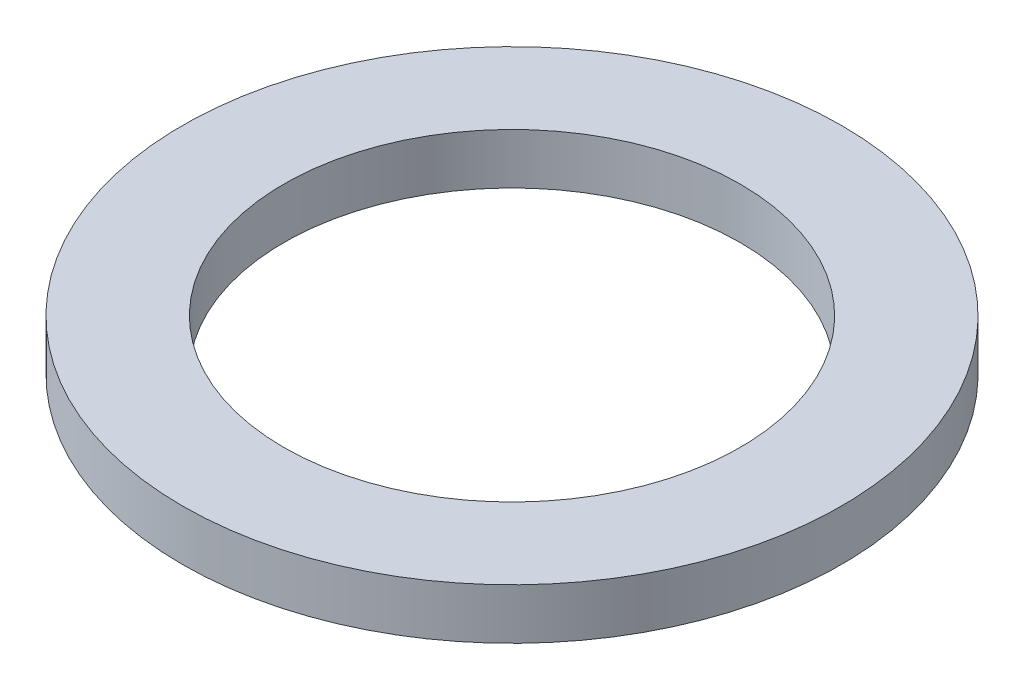
ISO-10303-21;
HEADER;
FILE_DESCRIPTION(('STEP AP214'),'2;1');
FILE_NAME('part.step','',(''),(''),'','','');
FILE_SCHEMA(('AUTOMOTIVE_DESIGN { 1 0 10303 214 1 1 1 1 }'));
ENDSEC;
DATA;
#1=APPLICATION_CONTEXT('core data for automotive mechanical design processes');
#2=APPLICATION_PROTOCOL_DEFINITION('international standard','automotive_design',2000,#1);
#3=PRODUCT_CONTEXT('',#1,'mechanical');
#4=PRODUCT('Part','Part','',(#3));
#5=PRODUCT_RELATED_PRODUCT_CATEGORY('part','',(#4));
#6=PRODUCT_DEFINITION_FORMATION('','',#4);
#7=PRODUCT_DEFINITION_CONTEXT('part definition',#1,'design');
#8=PRODUCT_DEFINITION('design','',#6,#7);
#9=PRODUCT_DEFINITION_SHAPE('','',#8);
#10=(LENGTH_UNIT() NAMED_UNIT(*) SI_UNIT(.MILLI.,.METRE.));
#11=(NAMED_UNIT(*) PLANE_ANGLE_UNIT() SI_UNIT($,.RADIAN.));
#12=(NAMED_UNIT(*) SI_UNIT($,.STERADIAN.) SOLID_ANGLE_UNIT());
#13=UNCERTAINTY_MEASURE_WITH_UNIT(LENGTH_MEASURE(1.E-05),#10,'distance_accuracy_value','');
#14=(GEOMETRIC_REPRESENTATION_CONTEXT(3) GLOBAL_UNCERTAINTY_ASSIGNED_CONTEXT((#13)) GLOBAL_UNIT_ASSIGNED_CONTEXT((#10,
#11,#12)) REPRESENTATION_CONTEXT('',''));
#15=CARTESIAN_POINT('',(0.,0.,0.));
#16=DIRECTION('',(0.,0.,1.));
#17=DIRECTION('',(1.,0.,0.));
#18=AXIS2_PLACEMENT_3D('',#15,#16,#17);
#19=CARTESIAN_POINT('',(0.,0.5,0.));
#20=DIRECTION('',(0.,1.,0.));
#21=DIRECTION('',(0.,0.,1.));
#22=AXIS2_PLACEMENT_3D('',#19,#20,#21);
#23=PLANE('',#22);
#24=CARTESIAN_POINT('',(0.,0.5,0.));
#25=DIRECTION('',(0.,1.,0.));
#26=DIRECTION('',(0.,0.,1.));
#27=AXIS2_PLACEMENT_3D('',#24,#25,#26);
#28=CIRCLE('',#27,3.25);
#29=CARTESIAN_POINT('',(0.,0.5,3.25));
#30=VERTEX_POINT('',#29);
#31=EDGE_CURVE('E10',#30,#30,#28,.T.);
#32=ORIENTED_EDGE('',*,*,#31,.T.);
#33=EDGE_LOOP('',(#32));
#34=FACE_BOUND('',#33,.T.);
#35=CARTESIAN_POINT('',(0.,0.5,0.));
#36=DIRECTION('',(0.,1.,0.));
#37=DIRECTION('',(0.,0.,1.));
#38=AXIS2_PLACEMENT_3D('',#35,#36,#37);
#39=CIRCLE('',#38,2.25);
#40=CARTESIAN_POINT('',(0.,0.5,2.25));
#41=VERTEX_POINT('',#40);
#42=EDGE_CURVE('E50',#41,#41,#39,.T.);
#43=ORIENTED_EDGE('',*,*,#42,.F.);
#44=EDGE_LOOP('',(#43));
#45=FACE_BOUND('',#44,.T.);
#46=ADVANCED_FACE('F39',(#34,#45),#23,.T.);
#47=CARTESIAN_POINT('',(0.,0.,0.));
#48=DIRECTION('',(0.,1.,0.));
#49=DIRECTION('',(0.,0.,1.));
#50=AXIS2_PLACEMENT_3D('',#47,#48,#49);
#51=PLANE('',#50);
#52=CARTESIAN_POINT('',(0.,0.,0.));
#53=DIRECTION('',(0.,1.,0.));
#54=DIRECTION('',(0.,0.,1.));
#55=AXIS2_PLACEMENT_3D('',#52,#53,#54);
#56=CIRCLE('',#55,3.25);
#57=CARTESIAN_POINT('',(0.,0.,3.25));
#58=VERTEX_POINT('',#57);
#59=EDGE_CURVE('E43',#58,#58,#56,.T.);
#60=ORIENTED_EDGE('',*,*,#59,.F.);
#61=EDGE_LOOP('',(#60));
#62=FACE_BOUND('',#61,.T.);
#63=CARTESIAN_POINT('',(0.,0.,0.));
#64=DIRECTION('',(0.,1.,0.));
#65=DIRECTION('',(0.,0.,1.));
#66=AXIS2_PLACEMENT_3D('',#63,#64,#65);
#67=CIRCLE('',#66,2.25);
#68=CARTESIAN_POINT('',(0.,0.,2.25));
#69=VERTEX_POINT('',#68);
#70=EDGE_CURVE('E52',#69,#69,#67,.T.);
#71=ORIENTED_EDGE('',*,*,#70,.T.);
#72=EDGE_LOOP('',(#71));
#73=FACE_BOUND('',#72,.T.);
#74=ADVANCED_FACE('F62',(#62,#73),#51,.F.);
#75=CARTESIAN_POINT('',(0.,0.5,0.));
#76=DIRECTION('',(0.,-1.,0.));
#77=DIRECTION('',(0.,0.,-1.));
#78=AXIS2_PLACEMENT_3D('',#75,#76,#77);
#79=CYLINDRICAL_SURFACE('',#78,3.25);
#80=ORIENTED_EDGE('',*,*,#31,.F.);
#81=EDGE_LOOP('',(#80));
#82=FACE_BOUND('',#81,.T.);
#83=ORIENTED_EDGE('',*,*,#59,.T.);
#84=EDGE_LOOP('',(#83));
#85=FACE_BOUND('',#84,.T.);
#86=ADVANCED_FACE('F41',(#82,#85),#79,.T.);
#87=CARTESIAN_POINT('',(0.,0.5,0.));
#88=DIRECTION('',(0.,-1.,0.));
#89=DIRECTION('',(0.,0.,-1.));
#90=AXIS2_PLACEMENT_3D('',#87,#88,#89);
#91=CYLINDRICAL_SURFACE('',#90,2.25);
#92=ORIENTED_EDGE('',*,*,#42,.T.);
#93=EDGE_LOOP('',(#92));
#94=FACE_BOUND('',#93,.T.);
#95=ORIENTED_EDGE('',*,*,#70,.F.);
#96=EDGE_LOOP('',(#95));
#97=FACE_BOUND('',#96,.T.);
#98=ADVANCED_FACE('F58',(#94,#97),#91,.F.);
#99=CLOSED_SHELL('',(#46,#74,#86,#98));
#100=MANIFOLD_SOLID_BREP('B2',#99);
#101=ADVANCED_BREP_SHAPE_REPRESENTATION('',(#18,#100),#14);
#102=SHAPE_DEFINITION_REPRESENTATION(#9,#101);
ENDSEC;
END-ISO-10303-21;
